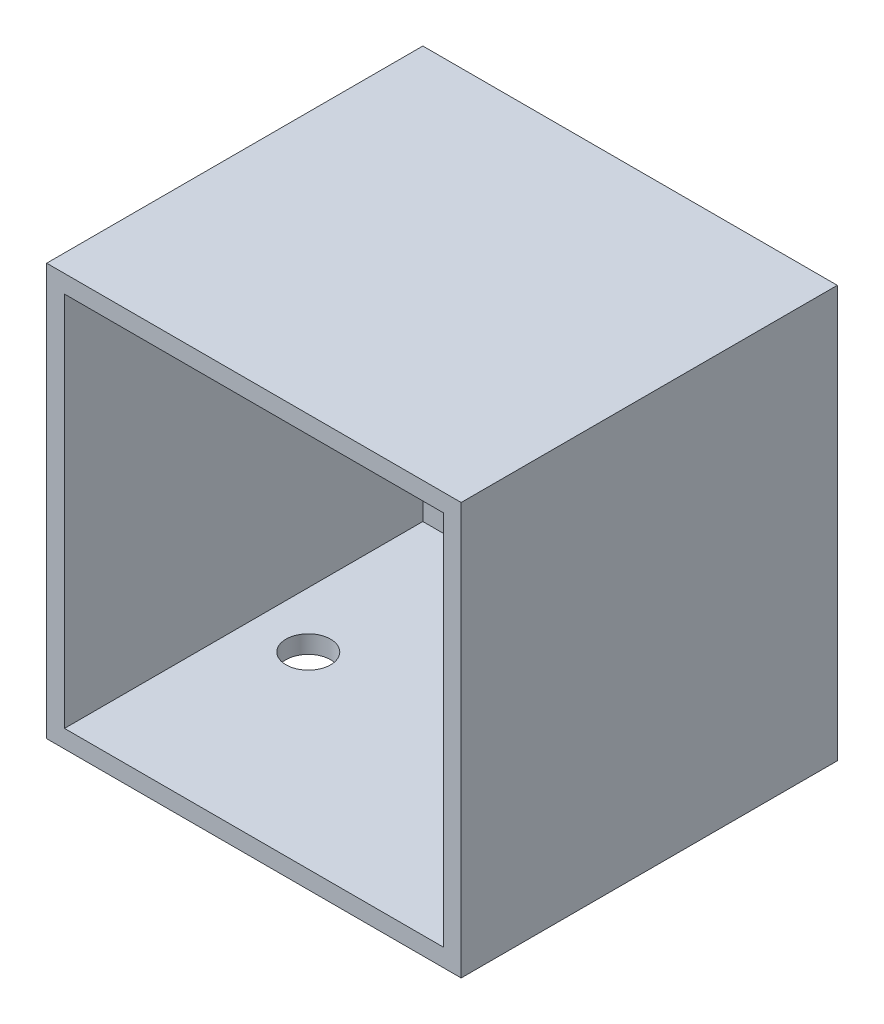
ISO-10303-21;
HEADER;
FILE_DESCRIPTION(('STEP AP214'),'2;1');
FILE_NAME('part.step','',(''),(''),'','','');
FILE_SCHEMA(('AUTOMOTIVE_DESIGN { 1 0 10303 214 1 1 1 1 }'));
ENDSEC;
DATA;
#1=APPLICATION_CONTEXT('core data for automotive mechanical design processes');
#2=APPLICATION_PROTOCOL_DEFINITION('international standard','automotive_design',2000,#1);
#3=PRODUCT_CONTEXT('',#1,'mechanical');
#4=PRODUCT('Part','Part','',(#3));
#5=PRODUCT_RELATED_PRODUCT_CATEGORY('part','',(#4));
#6=PRODUCT_DEFINITION_FORMATION('','',#4);
#7=PRODUCT_DEFINITION_CONTEXT('part definition',#1,'design');
#8=PRODUCT_DEFINITION('design','',#6,#7);
#9=PRODUCT_DEFINITION_SHAPE('','',#8);
#10=(LENGTH_UNIT() NAMED_UNIT(*) SI_UNIT(.MILLI.,.METRE.));
#11=(NAMED_UNIT(*) PLANE_ANGLE_UNIT() SI_UNIT($,.RADIAN.));
#12=(NAMED_UNIT(*) SI_UNIT($,.STERADIAN.) SOLID_ANGLE_UNIT());
#13=UNCERTAINTY_MEASURE_WITH_UNIT(LENGTH_MEASURE(1.E-05),#10,'distance_accuracy_value','');
#14=(GEOMETRIC_REPRESENTATION_CONTEXT(3) GLOBAL_UNCERTAINTY_ASSIGNED_CONTEXT((#13)) GLOBAL_UNIT_ASSIGNED_CONTEXT((#10,
#11,#12)) REPRESENTATION_CONTEXT('',''));
#15=CARTESIAN_POINT('',(0.,0.,0.));
#16=DIRECTION('',(0.,0.,1.));
#17=DIRECTION('',(1.,0.,0.));
#18=AXIS2_PLACEMENT_3D('',#15,#16,#17);
#19=CARTESIAN_POINT('',(0.,2.,0.));
#20=DIRECTION('',(0.,-1.,0.));
#21=DIRECTION('',(0.,0.,-1.));
#22=AXIS2_PLACEMENT_3D('',#19,#20,#21);
#23=PLANE('',#22);
#24=CARTESIAN_POINT('',(15.,2.,0.));
#25=DIRECTION('',(0.,1.,0.));
#26=DIRECTION('',(0.,0.,-1.));
#27=AXIS2_PLACEMENT_3D('',#24,#25,#26);
#28=CIRCLE('',#27,2.5);
#29=CARTESIAN_POINT('',(15.,2.,-2.5));
#30=VERTEX_POINT('',#29);
#31=EDGE_CURVE('E164',#30,#30,#28,.T.);
#32=ORIENTED_EDGE('',*,*,#31,.F.);
#33=EDGE_LOOP('',(#32));
#34=FACE_BOUND('',#33,.T.);
#35=CARTESIAN_POINT('',(-15.,2.,0.));
#36=DIRECTION('',(0.,1.,0.));
#37=DIRECTION('',(0.,0.,1.));
#38=AXIS2_PLACEMENT_3D('',#35,#36,#37);
#39=CIRCLE('',#38,2.5);
#40=CARTESIAN_POINT('',(-15.,2.,2.5));
#41=VERTEX_POINT('',#40);
#42=EDGE_CURVE('E170',#41,#41,#39,.T.);
#43=ORIENTED_EDGE('',*,*,#42,.F.);
#44=EDGE_LOOP('',(#43));
#45=FACE_BOUND('',#44,.T.);
#46=DIRECTION('',(0.,0.,1.));
#47=VECTOR('',#46,1.);
#48=CARTESIAN_POINT('',(21.25,2.,-19.1));
#49=LINE('',#48,#47);
#50=CARTESIAN_POINT('',(21.25,2.,-19.1));
#51=VERTEX_POINT('',#50);
#52=CARTESIAN_POINT('',(21.25,2.,21.1));
#53=VERTEX_POINT('',#52);
#54=EDGE_CURVE('E56',#51,#53,#49,.T.);
#55=ORIENTED_EDGE('',*,*,#54,.F.);
#56=DIRECTION('',(1.,0.,0.));
#57=VECTOR('',#56,1.);
#58=CARTESIAN_POINT('',(-21.25,2.,-19.1));
#59=LINE('',#58,#57);
#60=CARTESIAN_POINT('',(-21.25,2.,-19.1));
#61=VERTEX_POINT('',#60);
#62=EDGE_CURVE('E149',#61,#51,#59,.T.);
#63=ORIENTED_EDGE('',*,*,#62,.F.);
#64=DIRECTION('',(0.,0.,-1.));
#65=VECTOR('',#64,1.);
#66=CARTESIAN_POINT('',(-21.25,2.,21.1));
#67=LINE('',#66,#65);
#68=CARTESIAN_POINT('',(-21.25,2.,21.1));
#69=VERTEX_POINT('',#68);
#70=EDGE_CURVE('E135',#69,#61,#67,.T.);
#71=ORIENTED_EDGE('',*,*,#70,.F.);
#72=DIRECTION('',(1.,0.,0.));
#73=VECTOR('',#72,1.);
#74=CARTESIAN_POINT('',(-23.25,2.,21.1));
#75=LINE('',#74,#73);
#76=EDGE_CURVE('E61',#69,#53,#75,.T.);
#77=ORIENTED_EDGE('',*,*,#76,.T.);
#78=EDGE_LOOP('',(#55,#63,#71,#77));
#79=FACE_BOUND('',#78,.T.);
#80=ADVANCED_FACE('F41',(#34,#45,#79),#23,.F.);
#81=CARTESIAN_POINT('',(0.,0.,0.));
#82=DIRECTION('',(0.,-1.,0.));
#83=DIRECTION('',(0.,0.,-1.));
#84=AXIS2_PLACEMENT_3D('',#81,#82,#83);
#85=PLANE('',#84);
#86=CARTESIAN_POINT('',(-15.,0.,0.));
#87=DIRECTION('',(0.,1.,0.));
#88=DIRECTION('',(0.,0.,1.));
#89=AXIS2_PLACEMENT_3D('',#86,#87,#88);
#90=CIRCLE('',#89,2.5);
#91=CARTESIAN_POINT('',(-15.,0.,2.5));
#92=VERTEX_POINT('',#91);
#93=EDGE_CURVE('E167',#92,#92,#90,.T.);
#94=ORIENTED_EDGE('',*,*,#93,.T.);
#95=EDGE_LOOP('',(#94));
#96=FACE_BOUND('',#95,.T.);
#97=DIRECTION('',(0.,0.,-1.));
#98=VECTOR('',#97,1.);
#99=CARTESIAN_POINT('',(23.25,0.,21.1));
#100=LINE('',#99,#98);
#101=CARTESIAN_POINT('',(23.25,0.,21.1));
#102=VERTEX_POINT('',#101);
#103=CARTESIAN_POINT('',(23.25,0.,-21.1));
#104=VERTEX_POINT('',#103);
#105=EDGE_CURVE('E173',#102,#104,#100,.T.);
#106=ORIENTED_EDGE('',*,*,#105,.F.);
#107=DIRECTION('',(1.,0.,0.));
#108=VECTOR('',#107,1.);
#109=CARTESIAN_POINT('',(-23.25,0.,21.1));
#110=LINE('',#109,#108);
#111=CARTESIAN_POINT('',(-23.25,0.,21.1));
#112=VERTEX_POINT('',#111);
#113=EDGE_CURVE('E177',#112,#102,#110,.T.);
#114=ORIENTED_EDGE('',*,*,#113,.F.);
#115=DIRECTION('',(0.,0.,1.));
#116=VECTOR('',#115,1.);
#117=CARTESIAN_POINT('',(-23.25,0.,21.1));
#118=LINE('',#117,#116);
#119=CARTESIAN_POINT('',(-23.25,0.,-21.1));
#120=VERTEX_POINT('',#119);
#121=EDGE_CURVE('E111',#120,#112,#118,.T.);
#122=ORIENTED_EDGE('',*,*,#121,.F.);
#123=DIRECTION('',(-1.,0.,0.));
#124=VECTOR('',#123,1.);
#125=CARTESIAN_POINT('',(-23.25,0.,-21.1));
#126=LINE('',#125,#124);
#127=EDGE_CURVE('E180',#104,#120,#126,.T.);
#128=ORIENTED_EDGE('',*,*,#127,.F.);
#129=EDGE_LOOP('',(#106,#114,#122,#128));
#130=FACE_BOUND('',#129,.T.);
#131=CARTESIAN_POINT('',(15.,0.,0.));
#132=DIRECTION('',(0.,1.,0.));
#133=DIRECTION('',(0.,0.,-1.));
#134=AXIS2_PLACEMENT_3D('',#131,#132,#133);
#135=CIRCLE('',#134,2.5);
#136=CARTESIAN_POINT('',(15.,0.,-2.5));
#137=VERTEX_POINT('',#136);
#138=EDGE_CURVE('E163',#137,#137,#135,.T.);
#139=ORIENTED_EDGE('',*,*,#138,.T.);
#140=EDGE_LOOP('',(#139));
#141=FACE_BOUND('',#140,.T.);
#142=ADVANCED_FACE('F187',(#96,#130,#141),#85,.T.);
#143=CARTESIAN_POINT('',(23.25,2.,21.1));
#144=DIRECTION('',(-1.,0.,0.));
#145=DIRECTION('',(0.,0.,1.));
#146=AXIS2_PLACEMENT_3D('',#143,#144,#145);
#147=PLANE('',#146);
#148=ORIENTED_EDGE('',*,*,#105,.T.);
#149=DIRECTION('',(0.,-1.,0.));
#150=VECTOR('',#149,1.);
#151=CARTESIAN_POINT('',(23.25,2.,-21.1));
#152=LINE('',#151,#150);
#153=CARTESIAN_POINT('',(23.25,46.2,-21.1));
#154=VERTEX_POINT('',#153);
#155=EDGE_CURVE('E11',#154,#104,#152,.T.);
#156=ORIENTED_EDGE('',*,*,#155,.F.);
#157=DIRECTION('',(0.,0.,-1.));
#158=VECTOR('',#157,1.);
#159=CARTESIAN_POINT('',(23.25,46.2,-21.1));
#160=LINE('',#159,#158);
#161=CARTESIAN_POINT('',(23.25,46.2,21.1));
#162=VERTEX_POINT('',#161);
#163=EDGE_CURVE('E123',#162,#154,#160,.T.);
#164=ORIENTED_EDGE('',*,*,#163,.F.);
#165=DIRECTION('',(0.,-1.,0.));
#166=VECTOR('',#165,1.);
#167=CARTESIAN_POINT('',(23.25,2.,21.1));
#168=LINE('',#167,#166);
#169=EDGE_CURVE('E114',#162,#102,#168,.T.);
#170=ORIENTED_EDGE('',*,*,#169,.T.);
#171=EDGE_LOOP('',(#148,#156,#164,#170));
#172=FACE_BOUND('',#171,.T.);
#173=ADVANCED_FACE('F43',(#172),#147,.F.);
#174=CARTESIAN_POINT('',(-23.25,2.,-21.1));
#175=DIRECTION('',(0.,0.,1.));
#176=DIRECTION('',(1.,0.,0.));
#177=AXIS2_PLACEMENT_3D('',#174,#175,#176);
#178=PLANE('',#177);
#179=ORIENTED_EDGE('',*,*,#127,.T.);
#180=DIRECTION('',(0.,-1.,0.));
#181=VECTOR('',#180,1.);
#182=CARTESIAN_POINT('',(-23.25,2.,-21.1));
#183=LINE('',#182,#181);
#184=CARTESIAN_POINT('',(-23.25,46.2,-21.1));
#185=VERTEX_POINT('',#184);
#186=EDGE_CURVE('E49',#185,#120,#183,.T.);
#187=ORIENTED_EDGE('',*,*,#186,.F.);
#188=DIRECTION('',(-1.,0.,0.));
#189=VECTOR('',#188,1.);
#190=CARTESIAN_POINT('',(-23.25,46.2,-21.1));
#191=LINE('',#190,#189);
#192=EDGE_CURVE('E128',#154,#185,#191,.T.);
#193=ORIENTED_EDGE('',*,*,#192,.F.);
#194=ORIENTED_EDGE('',*,*,#155,.T.);
#195=EDGE_LOOP('',(#179,#187,#193,#194));
#196=FACE_BOUND('',#195,.T.);
#197=ADVANCED_FACE('F190',(#196),#178,.F.);
#198=CARTESIAN_POINT('',(-23.25,2.,21.1));
#199=DIRECTION('',(1.,0.,0.));
#200=DIRECTION('',(0.,0.,-1.));
#201=AXIS2_PLACEMENT_3D('',#198,#199,#200);
#202=PLANE('',#201);
#203=ORIENTED_EDGE('',*,*,#121,.T.);
#204=DIRECTION('',(0.,-1.,0.));
#205=VECTOR('',#204,1.);
#206=CARTESIAN_POINT('',(-23.25,2.,21.1));
#207=LINE('',#206,#205);
#208=CARTESIAN_POINT('',(-23.25,46.2,21.1));
#209=VERTEX_POINT('',#208);
#210=EDGE_CURVE('E104',#209,#112,#207,.T.);
#211=ORIENTED_EDGE('',*,*,#210,.F.);
#212=DIRECTION('',(0.,0.,1.));
#213=VECTOR('',#212,1.);
#214=CARTESIAN_POINT('',(-23.25,46.2,-21.1));
#215=LINE('',#214,#213);
#216=EDGE_CURVE('E109',#185,#209,#215,.T.);
#217=ORIENTED_EDGE('',*,*,#216,.F.);
#218=ORIENTED_EDGE('',*,*,#186,.T.);
#219=EDGE_LOOP('',(#203,#211,#217,#218));
#220=FACE_BOUND('',#219,.T.);
#221=ADVANCED_FACE('F106',(#220),#202,.F.);
#222=CARTESIAN_POINT('',(-23.25,2.,21.1));
#223=DIRECTION('',(0.,0.,-1.));
#224=DIRECTION('',(-1.,0.,0.));
#225=AXIS2_PLACEMENT_3D('',#222,#223,#224);
#226=PLANE('',#225);
#227=DIRECTION('',(0.,-1.,0.));
#228=VECTOR('',#227,1.);
#229=CARTESIAN_POINT('',(-21.25,44.2,21.1));
#230=LINE('',#229,#228);
#231=CARTESIAN_POINT('',(-21.25,44.2,21.1));
#232=VERTEX_POINT('',#231);
#233=EDGE_CURVE('E160',#232,#69,#230,.T.);
#234=ORIENTED_EDGE('',*,*,#233,.F.);
#235=DIRECTION('',(1.,0.,0.));
#236=VECTOR('',#235,1.);
#237=CARTESIAN_POINT('',(-23.25,44.2,21.1));
#238=LINE('',#237,#236);
#239=CARTESIAN_POINT('',(21.25,44.2,21.1));
#240=VERTEX_POINT('',#239);
#241=EDGE_CURVE('E129',#232,#240,#238,.T.);
#242=ORIENTED_EDGE('',*,*,#241,.T.);
#243=DIRECTION('',(0.,-1.,0.));
#244=VECTOR('',#243,1.);
#245=CARTESIAN_POINT('',(21.25,44.2,21.1));
#246=LINE('',#245,#244);
#247=EDGE_CURVE('E146',#240,#53,#246,.T.);
#248=ORIENTED_EDGE('',*,*,#247,.T.);
#249=ORIENTED_EDGE('',*,*,#76,.F.);
#250=EDGE_LOOP('',(#234,#242,#248,#249));
#251=FACE_BOUND('',#250,.T.);
#252=ORIENTED_EDGE('',*,*,#113,.T.);
#253=ORIENTED_EDGE('',*,*,#169,.F.);
#254=DIRECTION('',(1.,0.,0.));
#255=VECTOR('',#254,1.);
#256=CARTESIAN_POINT('',(-23.25,46.2,21.1));
#257=LINE('',#256,#255);
#258=EDGE_CURVE('E117',#209,#162,#257,.T.);
#259=ORIENTED_EDGE('',*,*,#258,.F.);
#260=ORIENTED_EDGE('',*,*,#210,.T.);
#261=EDGE_LOOP('',(#252,#253,#259,#260));
#262=FACE_BOUND('',#261,.T.);
#263=ADVANCED_FACE('F118',(#251,#262),#226,.F.);
#264=CARTESIAN_POINT('',(-15.,2.,0.));
#265=DIRECTION('',(0.,-1.,0.));
#266=DIRECTION('',(0.,0.,-1.));
#267=AXIS2_PLACEMENT_3D('',#264,#265,#266);
#268=CYLINDRICAL_SURFACE('',#267,2.5);
#269=ORIENTED_EDGE('',*,*,#42,.T.);
#270=EDGE_LOOP('',(#269));
#271=FACE_BOUND('',#270,.T.);
#272=ORIENTED_EDGE('',*,*,#93,.F.);
#273=EDGE_LOOP('',(#272));
#274=FACE_BOUND('',#273,.T.);
#275=ADVANCED_FACE('F209',(#271,#274),#268,.F.);
#276=CARTESIAN_POINT('',(15.,2.,0.));
#277=DIRECTION('',(0.,-1.,0.));
#278=DIRECTION('',(0.,0.,-1.));
#279=AXIS2_PLACEMENT_3D('',#276,#277,#278);
#280=CYLINDRICAL_SURFACE('',#279,2.5);
#281=ORIENTED_EDGE('',*,*,#31,.T.);
#282=EDGE_LOOP('',(#281));
#283=FACE_BOUND('',#282,.T.);
#284=ORIENTED_EDGE('',*,*,#138,.F.);
#285=EDGE_LOOP('',(#284));
#286=FACE_BOUND('',#285,.T.);
#287=ADVANCED_FACE('F218',(#283,#286),#280,.F.);
#288=CARTESIAN_POINT('',(-21.25,44.2,21.1));
#289=DIRECTION('',(-1.,0.,0.));
#290=DIRECTION('',(0.,0.,1.));
#291=AXIS2_PLACEMENT_3D('',#288,#289,#290);
#292=PLANE('',#291);
#293=ORIENTED_EDGE('',*,*,#70,.T.);
#294=DIRECTION('',(0.,-1.,0.));
#295=VECTOR('',#294,1.);
#296=CARTESIAN_POINT('',(-21.25,44.2,-19.1));
#297=LINE('',#296,#295);
#298=CARTESIAN_POINT('',(-21.25,44.2,-19.1));
#299=VERTEX_POINT('',#298);
#300=EDGE_CURVE('E157',#299,#61,#297,.T.);
#301=ORIENTED_EDGE('',*,*,#300,.F.);
#302=DIRECTION('',(0.,0.,-1.));
#303=VECTOR('',#302,1.);
#304=CARTESIAN_POINT('',(-21.25,44.2,21.1));
#305=LINE('',#304,#303);
#306=EDGE_CURVE('E137',#232,#299,#305,.T.);
#307=ORIENTED_EDGE('',*,*,#306,.F.);
#308=ORIENTED_EDGE('',*,*,#233,.T.);
#309=EDGE_LOOP('',(#293,#301,#307,#308));
#310=FACE_BOUND('',#309,.T.);
#311=ADVANCED_FACE('F223',(#310),#292,.F.);
#312=CARTESIAN_POINT('',(-21.25,44.2,-19.1));
#313=DIRECTION('',(0.,0.,-1.));
#314=DIRECTION('',(-1.,0.,0.));
#315=AXIS2_PLACEMENT_3D('',#312,#313,#314);
#316=PLANE('',#315);
#317=ORIENTED_EDGE('',*,*,#62,.T.);
#318=DIRECTION('',(0.,-1.,0.));
#319=VECTOR('',#318,1.);
#320=CARTESIAN_POINT('',(21.25,44.2,-19.1));
#321=LINE('',#320,#319);
#322=CARTESIAN_POINT('',(21.25,44.2,-19.1));
#323=VERTEX_POINT('',#322);
#324=EDGE_CURVE('E154',#323,#51,#321,.T.);
#325=ORIENTED_EDGE('',*,*,#324,.F.);
#326=DIRECTION('',(1.,0.,0.));
#327=VECTOR('',#326,1.);
#328=CARTESIAN_POINT('',(-21.25,44.2,-19.1));
#329=LINE('',#328,#327);
#330=EDGE_CURVE('E140',#299,#323,#329,.T.);
#331=ORIENTED_EDGE('',*,*,#330,.F.);
#332=ORIENTED_EDGE('',*,*,#300,.T.);
#333=EDGE_LOOP('',(#317,#325,#331,#332));
#334=FACE_BOUND('',#333,.T.);
#335=ADVANCED_FACE('F231',(#334),#316,.F.);
#336=CARTESIAN_POINT('',(21.25,44.2,-19.1));
#337=DIRECTION('',(1.,0.,0.));
#338=DIRECTION('',(0.,0.,-1.));
#339=AXIS2_PLACEMENT_3D('',#336,#337,#338);
#340=PLANE('',#339);
#341=ORIENTED_EDGE('',*,*,#54,.T.);
#342=ORIENTED_EDGE('',*,*,#247,.F.);
#343=DIRECTION('',(0.,0.,1.));
#344=VECTOR('',#343,1.);
#345=CARTESIAN_POINT('',(21.25,44.2,-19.1));
#346=LINE('',#345,#344);
#347=EDGE_CURVE('E143',#323,#240,#346,.T.);
#348=ORIENTED_EDGE('',*,*,#347,.F.);
#349=ORIENTED_EDGE('',*,*,#324,.T.);
#350=EDGE_LOOP('',(#341,#342,#348,#349));
#351=FACE_BOUND('',#350,.T.);
#352=ADVANCED_FACE('F229',(#351),#340,.F.);
#353=CARTESIAN_POINT('',(0.,44.2,0.));
#354=DIRECTION('',(0.,1.,0.));
#355=DIRECTION('',(0.,0.,1.));
#356=AXIS2_PLACEMENT_3D('',#353,#354,#355);
#357=PLANE('',#356);
#358=ORIENTED_EDGE('',*,*,#241,.F.);
#359=ORIENTED_EDGE('',*,*,#306,.T.);
#360=ORIENTED_EDGE('',*,*,#330,.T.);
#361=ORIENTED_EDGE('',*,*,#347,.T.);
#362=EDGE_LOOP('',(#358,#359,#360,#361));
#363=FACE_BOUND('',#362,.T.);
#364=ADVANCED_FACE('F226',(#363),#357,.F.);
#365=CARTESIAN_POINT('',(0.,46.2,0.));
#366=DIRECTION('',(0.,1.,0.));
#367=DIRECTION('',(0.,0.,1.));
#368=AXIS2_PLACEMENT_3D('',#365,#366,#367);
#369=PLANE('',#368);
#370=ORIENTED_EDGE('',*,*,#216,.T.);
#371=ORIENTED_EDGE('',*,*,#258,.T.);
#372=ORIENTED_EDGE('',*,*,#163,.T.);
#373=ORIENTED_EDGE('',*,*,#192,.T.);
#374=EDGE_LOOP('',(#370,#371,#372,#373));
#375=FACE_BOUND('',#374,.T.);
#376=ADVANCED_FACE('F126',(#375),#369,.T.);
#377=CLOSED_SHELL('',(#80,#142,#173,#197,#221,#263,#275,#287,#311,#335,#352,#364,#376));
#378=MANIFOLD_SOLID_BREP('B2',#377);
#379=ADVANCED_BREP_SHAPE_REPRESENTATION('',(#18,#378),#14);
#380=SHAPE_DEFINITION_REPRESENTATION(#9,#379);
ENDSEC;
END-ISO-10303-21;
